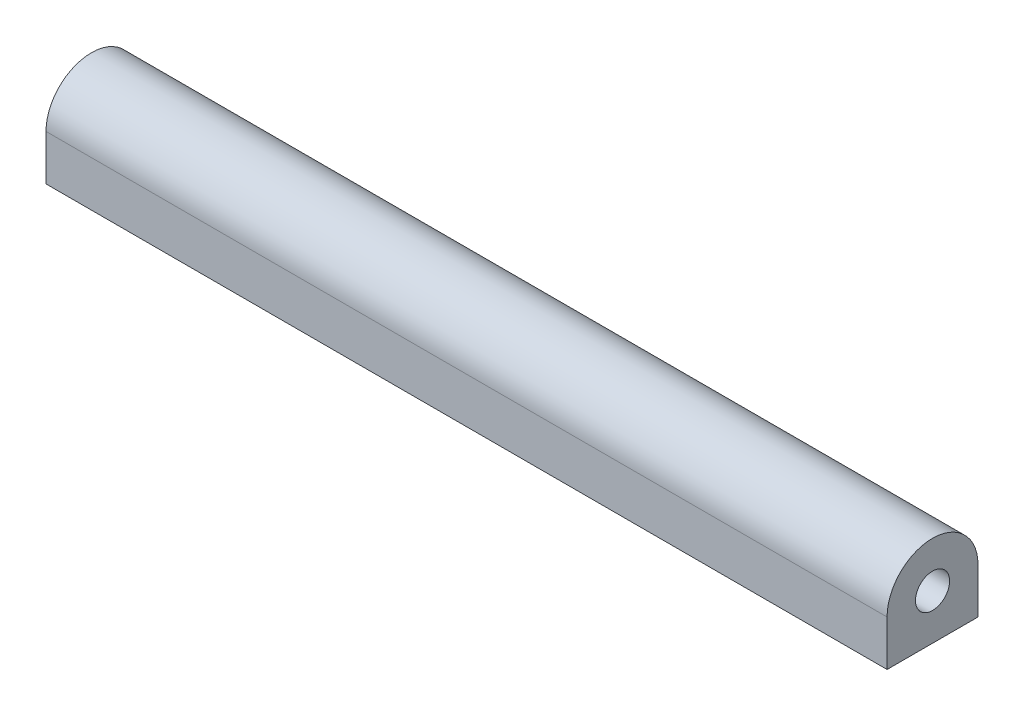
ISO-10303-21;
HEADER;
FILE_DESCRIPTION(('STEP AP214'),'2;1');
FILE_NAME('part.step','',(''),(''),'','','');
FILE_SCHEMA(('AUTOMOTIVE_DESIGN { 1 0 10303 214 1 1 1 1 }'));
ENDSEC;
DATA;
#1=APPLICATION_CONTEXT('core data for automotive mechanical design processes');
#2=APPLICATION_PROTOCOL_DEFINITION('international standard','automotive_design',2000,#1);
#3=PRODUCT_CONTEXT('',#1,'mechanical');
#4=PRODUCT('Part','Part','',(#3));
#5=PRODUCT_RELATED_PRODUCT_CATEGORY('part','',(#4));
#6=PRODUCT_DEFINITION_FORMATION('','',#4);
#7=PRODUCT_DEFINITION_CONTEXT('part definition',#1,'design');
#8=PRODUCT_DEFINITION('design','',#6,#7);
#9=PRODUCT_DEFINITION_SHAPE('','',#8);
#10=(LENGTH_UNIT() NAMED_UNIT(*) SI_UNIT(.MILLI.,.METRE.));
#11=(NAMED_UNIT(*) PLANE_ANGLE_UNIT() SI_UNIT($,.RADIAN.));
#12=(NAMED_UNIT(*) SI_UNIT($,.STERADIAN.) SOLID_ANGLE_UNIT());
#13=UNCERTAINTY_MEASURE_WITH_UNIT(LENGTH_MEASURE(1.E-05),#10,'distance_accuracy_value','');
#14=(GEOMETRIC_REPRESENTATION_CONTEXT(3) GLOBAL_UNCERTAINTY_ASSIGNED_CONTEXT((#13)) GLOBAL_UNIT_ASSIGNED_CONTEXT((#10,
#11,#12)) REPRESENTATION_CONTEXT('',''));
#15=CARTESIAN_POINT('',(0.,0.,0.));
#16=DIRECTION('',(0.,0.,1.));
#17=DIRECTION('',(1.,0.,0.));
#18=AXIS2_PLACEMENT_3D('',#15,#16,#17);
#19=CARTESIAN_POINT('',(74.,0.,0.));
#20=DIRECTION('',(1.,0.,0.));
#21=DIRECTION('',(0.,0.,-1.));
#22=AXIS2_PLACEMENT_3D('',#19,#20,#21);
#23=PLANE('',#22);
#24=CARTESIAN_POINT('',(74.,0.,0.));
#25=DIRECTION('',(1.,0.,0.));
#26=DIRECTION('',(0.,0.,-1.));
#27=AXIS2_PLACEMENT_3D('',#24,#25,#26);
#28=CIRCLE('',#27,4.);
#29=CARTESIAN_POINT('',(74.,0.,-4.));
#30=VERTEX_POINT('',#29);
#31=CARTESIAN_POINT('',(74.,0.,4.));
#32=VERTEX_POINT('',#31);
#33=EDGE_CURVE('E85',#30,#32,#28,.T.);
#34=ORIENTED_EDGE('',*,*,#33,.T.);
#35=DIRECTION('',(0.,-1.,0.));
#36=VECTOR('',#35,1.);
#37=CARTESIAN_POINT('',(74.,0.,4.));
#38=LINE('',#37,#36);
#39=CARTESIAN_POINT('',(74.,-4.,4.));
#40=VERTEX_POINT('',#39);
#41=EDGE_CURVE('E80',#32,#40,#38,.T.);
#42=ORIENTED_EDGE('',*,*,#41,.T.);
#43=DIRECTION('',(0.,0.,-1.));
#44=VECTOR('',#43,1.);
#45=CARTESIAN_POINT('',(74.,-4.,4.));
#46=LINE('',#45,#44);
#47=CARTESIAN_POINT('',(74.,-4.,-4.));
#48=VERTEX_POINT('',#47);
#49=EDGE_CURVE('E83',#40,#48,#46,.T.);
#50=ORIENTED_EDGE('',*,*,#49,.T.);
#51=DIRECTION('',(0.,1.,0.));
#52=VECTOR('',#51,1.);
#53=CARTESIAN_POINT('',(74.,-4.,-4.));
#54=LINE('',#53,#52);
#55=EDGE_CURVE('E50',#48,#30,#54,.T.);
#56=ORIENTED_EDGE('',*,*,#55,.T.);
#57=EDGE_LOOP('',(#34,#42,#50,#56));
#58=FACE_BOUND('',#57,.T.);
#59=CARTESIAN_POINT('',(74.,0.,0.));
#60=DIRECTION('',(1.,0.,0.));
#61=DIRECTION('',(0.,0.,-1.));
#62=AXIS2_PLACEMENT_3D('',#59,#60,#61);
#63=CIRCLE('',#62,1.5);
#64=CARTESIAN_POINT('',(74.,0.,-1.5));
#65=VERTEX_POINT('',#64);
#66=EDGE_CURVE('E100',#65,#65,#63,.T.);
#67=ORIENTED_EDGE('',*,*,#66,.F.);
#68=EDGE_LOOP('',(#67));
#69=FACE_BOUND('',#68,.T.);
#70=ADVANCED_FACE('F33',(#58,#69),#23,.T.);
#71=CARTESIAN_POINT('',(0.,0.,0.));
#72=DIRECTION('',(1.,0.,0.));
#73=DIRECTION('',(0.,0.,-1.));
#74=AXIS2_PLACEMENT_3D('',#71,#72,#73);
#75=PLANE('',#74);
#76=CARTESIAN_POINT('',(0.,0.,0.));
#77=DIRECTION('',(1.,0.,0.));
#78=DIRECTION('',(0.,0.,-1.));
#79=AXIS2_PLACEMENT_3D('',#76,#77,#78);
#80=CIRCLE('',#79,4.);
#81=CARTESIAN_POINT('',(0.,0.,-4.));
#82=VERTEX_POINT('',#81);
#83=CARTESIAN_POINT('',(0.,0.,4.));
#84=VERTEX_POINT('',#83);
#85=EDGE_CURVE('E97',#82,#84,#80,.T.);
#86=ORIENTED_EDGE('',*,*,#85,.F.);
#87=DIRECTION('',(0.,1.,0.));
#88=VECTOR('',#87,1.);
#89=CARTESIAN_POINT('',(0.,-4.,-4.));
#90=LINE('',#89,#88);
#91=CARTESIAN_POINT('',(0.,-4.,-4.));
#92=VERTEX_POINT('',#91);
#93=EDGE_CURVE('E73',#92,#82,#90,.T.);
#94=ORIENTED_EDGE('',*,*,#93,.F.);
#95=DIRECTION('',(0.,0.,-1.));
#96=VECTOR('',#95,1.);
#97=CARTESIAN_POINT('',(0.,-4.,4.));
#98=LINE('',#97,#96);
#99=CARTESIAN_POINT('',(0.,-4.,4.));
#100=VERTEX_POINT('',#99);
#101=EDGE_CURVE('E67',#100,#92,#98,.T.);
#102=ORIENTED_EDGE('',*,*,#101,.F.);
#103=DIRECTION('',(0.,-1.,0.));
#104=VECTOR('',#103,1.);
#105=CARTESIAN_POINT('',(0.,0.,4.));
#106=LINE('',#105,#104);
#107=EDGE_CURVE('E89',#84,#100,#106,.T.);
#108=ORIENTED_EDGE('',*,*,#107,.F.);
#109=EDGE_LOOP('',(#86,#94,#102,#108));
#110=FACE_BOUND('',#109,.T.);
#111=CARTESIAN_POINT('',(0.,0.,0.));
#112=DIRECTION('',(1.,0.,0.));
#113=DIRECTION('',(0.,0.,-1.));
#114=AXIS2_PLACEMENT_3D('',#111,#112,#113);
#115=CIRCLE('',#114,1.5);
#116=CARTESIAN_POINT('',(0.,0.,-1.5));
#117=VERTEX_POINT('',#116);
#118=EDGE_CURVE('E112',#117,#117,#115,.T.);
#119=ORIENTED_EDGE('',*,*,#118,.T.);
#120=EDGE_LOOP('',(#119));
#121=FACE_BOUND('',#120,.T.);
#122=ADVANCED_FACE('F108',(#110,#121),#75,.F.);
#123=CARTESIAN_POINT('',(74.,0.,0.));
#124=DIRECTION('',(-1.,0.,0.));
#125=DIRECTION('',(0.,0.,1.));
#126=AXIS2_PLACEMENT_3D('',#123,#124,#125);
#127=CYLINDRICAL_SURFACE('',#126,4.);
#128=ORIENTED_EDGE('',*,*,#85,.T.);
#129=DIRECTION('',(-1.,0.,0.));
#130=VECTOR('',#129,1.);
#131=CARTESIAN_POINT('',(74.,0.,4.));
#132=LINE('',#131,#130);
#133=EDGE_CURVE('E11',#32,#84,#132,.T.);
#134=ORIENTED_EDGE('',*,*,#133,.F.);
#135=ORIENTED_EDGE('',*,*,#33,.F.);
#136=DIRECTION('',(-1.,0.,0.));
#137=VECTOR('',#136,1.);
#138=CARTESIAN_POINT('',(74.,0.,-4.));
#139=LINE('',#138,#137);
#140=EDGE_CURVE('E93',#30,#82,#139,.T.);
#141=ORIENTED_EDGE('',*,*,#140,.T.);
#142=EDGE_LOOP('',(#128,#134,#135,#141));
#143=FACE_BOUND('',#142,.T.);
#144=ADVANCED_FACE('F35',(#143),#127,.T.);
#145=CARTESIAN_POINT('',(74.,0.,4.));
#146=DIRECTION('',(0.,0.,-1.));
#147=DIRECTION('',(-1.,0.,0.));
#148=AXIS2_PLACEMENT_3D('',#145,#146,#147);
#149=PLANE('',#148);
#150=ORIENTED_EDGE('',*,*,#107,.T.);
#151=DIRECTION('',(-1.,0.,0.));
#152=VECTOR('',#151,1.);
#153=CARTESIAN_POINT('',(74.,-4.,4.));
#154=LINE('',#153,#152);
#155=EDGE_CURVE('E42',#40,#100,#154,.T.);
#156=ORIENTED_EDGE('',*,*,#155,.F.);
#157=ORIENTED_EDGE('',*,*,#41,.F.);
#158=ORIENTED_EDGE('',*,*,#133,.T.);
#159=EDGE_LOOP('',(#150,#156,#157,#158));
#160=FACE_BOUND('',#159,.T.);
#161=ADVANCED_FACE('F88',(#160),#149,.F.);
#162=CARTESIAN_POINT('',(74.,-4.,4.));
#163=DIRECTION('',(0.,1.,0.));
#164=DIRECTION('',(0.,0.,1.));
#165=AXIS2_PLACEMENT_3D('',#162,#163,#164);
#166=PLANE('',#165);
#167=ORIENTED_EDGE('',*,*,#101,.T.);
#168=DIRECTION('',(-1.,0.,0.));
#169=VECTOR('',#168,1.);
#170=CARTESIAN_POINT('',(74.,-4.,-4.));
#171=LINE('',#170,#169);
#172=EDGE_CURVE('E90',#48,#92,#171,.T.);
#173=ORIENTED_EDGE('',*,*,#172,.F.);
#174=ORIENTED_EDGE('',*,*,#49,.F.);
#175=ORIENTED_EDGE('',*,*,#155,.T.);
#176=EDGE_LOOP('',(#167,#173,#174,#175));
#177=FACE_BOUND('',#176,.T.);
#178=ADVANCED_FACE('F91',(#177),#166,.F.);
#179=CARTESIAN_POINT('',(74.,-4.,-4.));
#180=DIRECTION('',(0.,0.,1.));
#181=DIRECTION('',(1.,0.,0.));
#182=AXIS2_PLACEMENT_3D('',#179,#180,#181);
#183=PLANE('',#182);
#184=ORIENTED_EDGE('',*,*,#93,.T.);
#185=ORIENTED_EDGE('',*,*,#140,.F.);
#186=ORIENTED_EDGE('',*,*,#55,.F.);
#187=ORIENTED_EDGE('',*,*,#172,.T.);
#188=EDGE_LOOP('',(#184,#185,#186,#187));
#189=FACE_BOUND('',#188,.T.);
#190=ADVANCED_FACE('F105',(#189),#183,.F.);
#191=CARTESIAN_POINT('',(74.,0.,0.));
#192=DIRECTION('',(-1.,0.,0.));
#193=DIRECTION('',(0.,0.,1.));
#194=AXIS2_PLACEMENT_3D('',#191,#192,#193);
#195=CYLINDRICAL_SURFACE('',#194,1.5);
#196=ORIENTED_EDGE('',*,*,#66,.T.);
#197=EDGE_LOOP('',(#196));
#198=FACE_BOUND('',#197,.T.);
#199=ORIENTED_EDGE('',*,*,#118,.F.);
#200=EDGE_LOOP('',(#199));
#201=FACE_BOUND('',#200,.T.);
#202=ADVANCED_FACE('F118',(#198,#201),#195,.F.);
#203=CLOSED_SHELL('',(#70,#122,#144,#161,#178,#190,#202));
#204=MANIFOLD_SOLID_BREP('B2',#203);
#205=ADVANCED_BREP_SHAPE_REPRESENTATION('',(#18,#204),#14);
#206=SHAPE_DEFINITION_REPRESENTATION(#9,#205);
ENDSEC;
END-ISO-10303-21;
